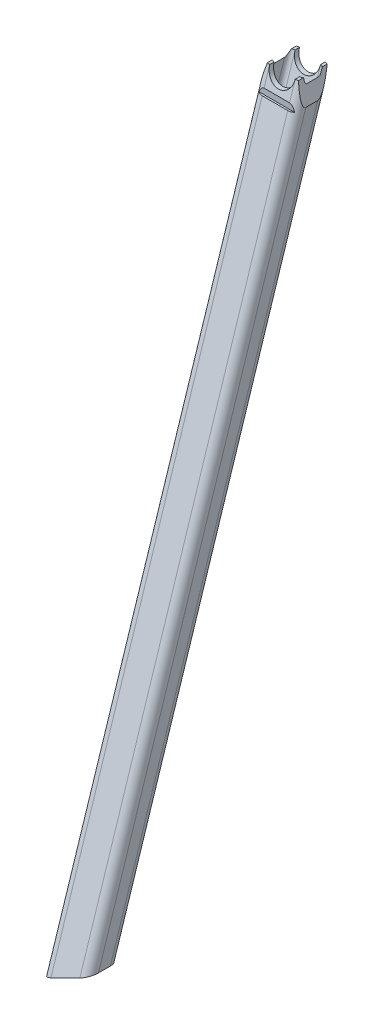
ISO-10303-21;
HEADER;
FILE_DESCRIPTION(('STEP AP214'),'2;1');
FILE_NAME('part.step','',(''),(''),'','','');
FILE_SCHEMA(('AUTOMOTIVE_DESIGN { 1 0 10303 214 1 1 1 1 }'));
ENDSEC;
DATA;
#1=APPLICATION_CONTEXT('core data for automotive mechanical design processes');
#2=APPLICATION_PROTOCOL_DEFINITION('international standard','automotive_design',2000,#1);
#3=PRODUCT_CONTEXT('',#1,'mechanical');
#4=PRODUCT('Part','Part','',(#3));
#5=PRODUCT_RELATED_PRODUCT_CATEGORY('part','',(#4));
#6=PRODUCT_DEFINITION_FORMATION('','',#4);
#7=PRODUCT_DEFINITION_CONTEXT('part definition',#1,'design');
#8=PRODUCT_DEFINITION('design','',#6,#7);
#9=PRODUCT_DEFINITION_SHAPE('','',#8);
#10=(LENGTH_UNIT() NAMED_UNIT(*) SI_UNIT(.MILLI.,.METRE.));
#11=(NAMED_UNIT(*) PLANE_ANGLE_UNIT() SI_UNIT($,.RADIAN.));
#12=(NAMED_UNIT(*) SI_UNIT($,.STERADIAN.) SOLID_ANGLE_UNIT());
#13=UNCERTAINTY_MEASURE_WITH_UNIT(LENGTH_MEASURE(1.E-05),#10,'distance_accuracy_value','');
#14=(GEOMETRIC_REPRESENTATION_CONTEXT(3) GLOBAL_UNCERTAINTY_ASSIGNED_CONTEXT((#13)) GLOBAL_UNIT_ASSIGNED_CONTEXT((#10,
#11,#12)) REPRESENTATION_CONTEXT('',''));
#15=CARTESIAN_POINT('',(0.,0.,0.));
#16=DIRECTION('',(0.,0.,1.));
#17=DIRECTION('',(1.,0.,0.));
#18=AXIS2_PLACEMENT_3D('',#15,#16,#17);
#19=CARTESIAN_POINT('',(0.,3.057033245491,9.52126817897499));
#20=DIRECTION('',(0.,-0.305703324549103,-0.952126817897504));
#21=DIRECTION('',(0.,0.952126817897505,-0.305703324549102));
#22=AXIS2_PLACEMENT_3D('',#19,#20,#21);
#23=PLANE('',#22);
#24=DIRECTION('',(-1.,0.,0.));
#25=VECTOR('',#24,1.);
#26=CARTESIAN_POINT('',(2.22044604925031E-13,-12.4494519813519,14.5));
#27=LINE('',#26,#25);
#28=CARTESIAN_POINT('',(9.00000000000001,-12.4494519813525,14.4999999999999));
#29=VERTEX_POINT('',#28);
#30=CARTESIAN_POINT('',(-9.00000000000001,-12.4494519813525,14.5));
#31=VERTEX_POINT('',#30);
#32=EDGE_CURVE('E206',#29,#31,#27,.T.);
#33=ORIENTED_EDGE('',*,*,#32,.F.);
#34=DIRECTION('',(0.,-0.952126817897505,0.305703324549102));
#35=VECTOR('',#34,1.);
#36=CARTESIAN_POINT('',(9.00000000000134,-1.11022302462516E-13,10.5028025805239));
#37=LINE('',#36,#35);
#38=CARTESIAN_POINT('',(9.00000000000134,-1.11022302462516E-13,10.5028025805239));
#39=VERTEX_POINT('',#38);
#40=EDGE_CURVE('E217',#29,#39,#37,.F.);
#41=ORIENTED_EDGE('',*,*,#40,.T.);
#42=CARTESIAN_POINT('',(0.,0.,10.5028025805239));
#43=DIRECTION('',(0.,-0.305703324549103,-0.952126817897504));
#44=DIRECTION('',(0.,-0.952126817897505,0.305703324549102));
#45=AXIS2_PLACEMENT_3D('',#42,#43,#44);
#46=ELLIPSE('',#45,9.45252232247159,9.);
#47=CARTESIAN_POINT('',(-9.00000000000001,-1.11022302462516E-13,10.5028025805239));
#48=VERTEX_POINT('',#47);
#49=EDGE_CURVE('E286',#39,#48,#46,.T.);
#50=ORIENTED_EDGE('',*,*,#49,.T.);
#51=DIRECTION('',(0.,0.952126817897505,-0.305703324549102));
#52=VECTOR('',#51,1.);
#53=CARTESIAN_POINT('',(-8.9999999999999,-483.960112896616,165.889892493982));
#54=LINE('',#53,#52);
#55=EDGE_CURVE('E339',#48,#31,#54,.F.);
#56=ORIENTED_EDGE('',*,*,#55,.T.);
#57=EDGE_LOOP('',(#33,#41,#50,#56));
#58=FACE_BOUND('',#57,.T.);
#59=ADVANCED_FACE('F44',(#58),#23,.F.);
#60=DIRECTION('',(1.,0.,0.));
#61=VECTOR('',#60,1.);
#62=CARTESIAN_POINT('',(0.,-16.5,15.8005263293399));
#63=LINE('',#62,#61);
#64=CARTESIAN_POINT('',(-9.00000000000001,-16.5000000000001,15.8005263293399));
#65=VERTEX_POINT('',#64);
#66=CARTESIAN_POINT('',(9.00000000000156,-16.5000000000001,15.8005263293399));
#67=VERTEX_POINT('',#66);
#68=EDGE_CURVE('E203',#65,#67,#63,.T.);
#69=ORIENTED_EDGE('',*,*,#68,.F.);
#70=CARTESIAN_POINT('',(-9.00000000000001,-481.413263999358,165.072165106852));
#71=VERTEX_POINT('',#70);
#72=EDGE_CURVE('E336',#65,#71,#54,.F.);
#73=ORIENTED_EDGE('',*,*,#72,.T.);
#74=DIRECTION('',(0.913345512368732,0.387692168498585,-0.124477939896055));
#75=VECTOR('',#74,1.);
#76=CARTESIAN_POINT('',(187.742025958265,-397.901228690018,138.258607969261));
#77=LINE('',#76,#75);
#78=CARTESIAN_POINT('',(9.00000000000001,-473.772717307585,162.618982945461));
#79=VERTEX_POINT('',#78);
#80=EDGE_CURVE('E298',#71,#79,#77,.T.);
#81=ORIENTED_EDGE('',*,*,#80,.T.);
#82=EDGE_CURVE('E345',#79,#67,#37,.F.);
#83=ORIENTED_EDGE('',*,*,#82,.T.);
#84=EDGE_LOOP('',(#69,#73,#81,#83));
#85=FACE_BOUND('',#84,.T.);
#86=ADVANCED_FACE('F385',(#85),#23,.F.);
#87=CARTESIAN_POINT('',(9.00000000000201,20.2653496561468,-2.30555921939207));
#88=DIRECTION('',(0.,0.952126817897505,-0.305703324549102));
#89=DIRECTION('',(0.,0.305703324549103,0.952126817897504));
#90=AXIS2_PLACEMENT_3D('',#87,#88,#89);
#91=CYLINDRICAL_SURFACE('',#90,6.);
#92=ORIENTED_EDGE('',*,*,#40,.F.);
#93=CARTESIAN_POINT('',(9.00000000000001,-32.0763239129865,14.5));
#94=DIRECTION('',(0.,0.,1.));
#95=DIRECTION('',(0.,1.,0.));
#96=AXIS2_PLACEMENT_3D('',#93,#94,#95);
#97=ELLIPSE('',#96,19.6268719316341,6.);
#98=CARTESIAN_POINT('',(12.6504642541504,-16.5,14.5));
#99=VERTEX_POINT('',#98);
#100=EDGE_CURVE('E215',#29,#99,#97,.F.);
#101=ORIENTED_EDGE('',*,*,#100,.T.);
#102=CARTESIAN_POINT('',(9.00000000000156,-16.5000000000001,9.49884478102551));
#103=DIRECTION('',(0.,1.,0.));
#104=DIRECTION('',(0.,0.,-1.));
#105=AXIS2_PLACEMENT_3D('',#102,#103,#104);
#106=ELLIPSE('',#105,6.30168154831439,6.);
#107=EDGE_CURVE('E201',#99,#67,#106,.F.);
#108=ORIENTED_EDGE('',*,*,#107,.T.);
#109=ORIENTED_EDGE('',*,*,#82,.F.);
#110=CARTESIAN_POINT('',(8.9999999999999,-473.772717307585,156.317301397147));
#111=DIRECTION('',(-0.390731128489274,0.920504853452441,0.));
#112=DIRECTION('',(0.711194291827604,0.301884066312843,-0.634876909155039));
#113=AXIS2_PLACEMENT_3D('',#110,#111,#112);
#114=ELLIPSE('',#113,6.84589714511482,6.);
#115=CARTESIAN_POINT('',(15.0000000000001,-471.225868410327,155.499574010017));
#116=VERTEX_POINT('',#115);
#117=EDGE_CURVE('E330',#116,#79,#114,.F.);
#118=ORIENTED_EDGE('',*,*,#117,.F.);
#119=DIRECTION('',(0.,-0.952126817897505,0.305703324549102));
#120=VECTOR('',#119,1.);
#121=CARTESIAN_POINT('',(15.,-473.060088357622,156.088494650946));
#122=LINE('',#121,#120);
#123=CARTESIAN_POINT('',(15.,-14.9999999999999,9.01723353113309));
#124=VERTEX_POINT('',#123);
#125=EDGE_CURVE('E331',#124,#116,#122,.T.);
#126=ORIENTED_EDGE('',*,*,#125,.F.);
#127=CARTESIAN_POINT('',(9.00000000000201,7.3923048454132,1.8276429147532));
#128=DIRECTION('',(-0.965925826289067,-0.25881904510253,0.));
#129=DIRECTION('',(-0.245605956195241,0.916613907162153,-0.315430910784522));
#130=AXIS2_PLACEMENT_3D('',#127,#128,#129);
#131=ELLIPSE('',#130,24.347827826264,6.);
#132=CARTESIAN_POINT('',(10.980762113533,0.,10.1495083750219));
#133=VERTEX_POINT('',#132);
#134=EDGE_CURVE('E361',#124,#133,#131,.T.);
#135=ORIENTED_EDGE('',*,*,#134,.T.);
#136=CARTESIAN_POINT('',(9.00000000000134,1.11022302462516E-13,4.20112103220954));
#137=DIRECTION('',(0.,1.,0.));
#138=DIRECTION('',(0.,0.,-1.));
#139=AXIS2_PLACEMENT_3D('',#136,#137,#138);
#140=ELLIPSE('',#139,6.30168154831439,6.);
#141=EDGE_CURVE('E314',#39,#133,#140,.T.);
#142=ORIENTED_EDGE('',*,*,#141,.F.);
#143=EDGE_LOOP('',(#92,#101,#108,#109,#118,#126,#135,#142));
#144=FACE_BOUND('',#143,.T.);
#145=ADVANCED_FACE('F220',(#144),#91,.T.);
#146=CARTESIAN_POINT('',(-8.99999999999956,20.2653496561463,-2.3055592193921));
#147=DIRECTION('',(0.,-0.952126817897505,0.305703324549102));
#148=DIRECTION('',(0.,-0.305703324549103,-0.952126817897504));
#149=AXIS2_PLACEMENT_3D('',#146,#147,#148);
#150=CYLINDRICAL_SURFACE('',#149,6.);
#151=CARTESIAN_POINT('',(-9.00000000000001,-16.5000000000001,9.49884478102551));
#152=DIRECTION('',(0.,1.,0.));
#153=DIRECTION('',(0.,0.,1.));
#154=AXIS2_PLACEMENT_3D('',#151,#152,#153);
#155=ELLIPSE('',#154,6.30168154831439,6.);
#156=CARTESIAN_POINT('',(-12.6504642541503,-16.5000000000001,14.5));
#157=VERTEX_POINT('',#156);
#158=EDGE_CURVE('E53',#65,#157,#155,.F.);
#159=ORIENTED_EDGE('',*,*,#158,.T.);
#160=CARTESIAN_POINT('',(-8.9999999999999,-32.0763239129867,14.5));
#161=DIRECTION('',(0.,0.,1.));
#162=DIRECTION('',(0.,-1.,0.));
#163=AXIS2_PLACEMENT_3D('',#160,#161,#162);
#164=ELLIPSE('',#163,19.6268719316341,6.);
#165=EDGE_CURVE('E12',#157,#31,#164,.F.);
#166=ORIENTED_EDGE('',*,*,#165,.T.);
#167=ORIENTED_EDGE('',*,*,#55,.F.);
#168=CARTESIAN_POINT('',(-9.00000000000001,-1.11022302462516E-13,4.20112103220954));
#169=DIRECTION('',(0.,1.,0.));
#170=DIRECTION('',(0.,0.,1.));
#171=AXIS2_PLACEMENT_3D('',#168,#169,#170);
#172=ELLIPSE('',#171,6.30168154831439,6.);
#173=CARTESIAN_POINT('',(-10.9807621135328,-1.11022302462516E-13,10.1495083750219));
#174=VERTEX_POINT('',#173);
#175=EDGE_CURVE('E308',#174,#48,#172,.T.);
#176=ORIENTED_EDGE('',*,*,#175,.F.);
#177=CARTESIAN_POINT('',(-9.00000000000012,7.39230484541464,1.8276429147532));
#178=DIRECTION('',(0.965925826289066,-0.258819045102527,0.));
#179=DIRECTION('',(-0.245605956195242,-0.916613907162153,0.315430910784522));
#180=AXIS2_PLACEMENT_3D('',#177,#178,#179);
#181=ELLIPSE('',#180,24.347827826264,6.);
#182=CARTESIAN_POINT('',(-15.,-15.,9.01723353113316));
#183=VERTEX_POINT('',#182);
#184=EDGE_CURVE('E356',#174,#183,#181,.T.);
#185=ORIENTED_EDGE('',*,*,#184,.T.);
#186=DIRECTION('',(0.,0.952126817897505,-0.305703324549102));
#187=VECTOR('',#186,1.);
#188=CARTESIAN_POINT('',(-14.9999999999979,-1.83421994729449,4.79004167313892));
#189=LINE('',#188,#187);
#190=CARTESIAN_POINT('',(-15.0000000000005,-483.960112896616,159.588210945667));
#191=VERTEX_POINT('',#190);
#192=EDGE_CURVE('E317',#191,#183,#189,.T.);
#193=ORIENTED_EDGE('',*,*,#192,.F.);
#194=CARTESIAN_POINT('',(-9.00000000000001,-481.413263999358,158.770483558537));
#195=DIRECTION('',(-0.390731128489274,0.920504853452441,0.));
#196=DIRECTION('',(-0.711194291827604,-0.301884066312843,0.634876909155039));
#197=AXIS2_PLACEMENT_3D('',#194,#195,#196);
#198=ELLIPSE('',#197,6.84589714511482,6.);
#199=EDGE_CURVE('E321',#71,#191,#198,.F.);
#200=ORIENTED_EDGE('',*,*,#199,.F.);
#201=ORIENTED_EDGE('',*,*,#72,.F.);
#202=EDGE_LOOP('',(#159,#166,#167,#176,#185,#193,#200,#201));
#203=FACE_BOUND('',#202,.T.);
#204=ADVANCED_FACE('F376',(#203),#150,.T.);
#205=CARTESIAN_POINT('',(0.,0.,0.));
#206=DIRECTION('',(0.,1.,0.));
#207=DIRECTION('',(0.,0.,1.));
#208=AXIS2_PLACEMENT_3D('',#205,#206,#207);
#209=PLANE('',#208);
#210=ORIENTED_EDGE('',*,*,#141,.T.);
#211=DIRECTION('',(0.,0.,-1.));
#212=VECTOR('',#211,1.);
#213=CARTESIAN_POINT('',(10.980762113533,0.,0.));
#214=LINE('',#213,#212);
#215=CARTESIAN_POINT('',(10.980762113533,0.,6.56753587915757));
#216=VERTEX_POINT('',#215);
#217=EDGE_CURVE('E370',#133,#216,#214,.T.);
#218=ORIENTED_EDGE('',*,*,#217,.T.);
#219=CARTESIAN_POINT('',(9.00000000000134,1.11022302462516E-13,4.20112103220954));
#220=DIRECTION('',(0.,1.,0.));
#221=DIRECTION('',(0.,0.,-1.));
#222=AXIS2_PLACEMENT_3D('',#219,#220,#221);
#223=ELLIPSE('',#222,3.1508407741572,3.);
#224=CARTESIAN_POINT('',(9.00000000000134,1.11022302462516E-13,7.35196180636673));
#225=VERTEX_POINT('',#224);
#226=EDGE_CURVE('E252',#225,#216,#223,.T.);
#227=ORIENTED_EDGE('',*,*,#226,.F.);
#228=DIRECTION('',(0.,0.,1.));
#229=VECTOR('',#228,1.);
#230=CARTESIAN_POINT('',(9.00000000000134,1.11022302462516E-13,-10.5028025805241));
#231=LINE('',#230,#229);
#232=EDGE_CURVE('E285',#39,#225,#231,.F.);
#233=ORIENTED_EDGE('',*,*,#232,.F.);
#234=EDGE_LOOP('',(#210,#218,#227,#233));
#235=FACE_BOUND('',#234,.T.);
#236=ADVANCED_FACE('F408',(#235),#209,.T.);
#237=CARTESIAN_POINT('',(-9.00000000000001,-1.11022302462516E-13,-4.20112103220966));
#238=DIRECTION('',(0.,1.,0.));
#239=DIRECTION('',(0.,0.,-1.));
#240=AXIS2_PLACEMENT_3D('',#237,#238,#239);
#241=ELLIPSE('',#240,6.30168154831439,6.);
#242=CARTESIAN_POINT('',(-9.00000000000001,1.11022302462516E-13,-10.5028025805241));
#243=VERTEX_POINT('',#242);
#244=CARTESIAN_POINT('',(-10.9807621135328,-1.11022302462516E-13,-10.149508375022));
#245=VERTEX_POINT('',#244);
#246=EDGE_CURVE('E316',#243,#245,#241,.T.);
#247=ORIENTED_EDGE('',*,*,#246,.T.);
#248=DIRECTION('',(0.,0.,1.));
#249=VECTOR('',#248,1.);
#250=CARTESIAN_POINT('',(-10.9807621135328,-1.11022302462516E-13,0.));
#251=LINE('',#250,#249);
#252=CARTESIAN_POINT('',(-10.9807621135328,-1.11022302462516E-13,-6.56753587915769));
#253=VERTEX_POINT('',#252);
#254=EDGE_CURVE('E351',#245,#253,#251,.T.);
#255=ORIENTED_EDGE('',*,*,#254,.T.);
#256=CARTESIAN_POINT('',(-9.00000000000001,-1.11022302462516E-13,-4.20112103220966));
#257=DIRECTION('',(0.,1.,0.));
#258=DIRECTION('',(0.,0.,-1.));
#259=AXIS2_PLACEMENT_3D('',#256,#257,#258);
#260=ELLIPSE('',#259,3.1508407741572,3.);
#261=CARTESIAN_POINT('',(-9.00000000000001,1.11022302462516E-13,-7.35196180636685));
#262=VERTEX_POINT('',#261);
#263=EDGE_CURVE('E231',#262,#253,#260,.T.);
#264=ORIENTED_EDGE('',*,*,#263,.F.);
#265=DIRECTION('',(0.,0.,1.));
#266=VECTOR('',#265,1.);
#267=CARTESIAN_POINT('',(-9.00000000000001,-1.11022302462516E-13,-10.5028025805241));
#268=LINE('',#267,#266);
#269=EDGE_CURVE('E287',#243,#262,#268,.T.);
#270=ORIENTED_EDGE('',*,*,#269,.F.);
#271=EDGE_LOOP('',(#247,#255,#264,#270));
#272=FACE_BOUND('',#271,.T.);
#273=ADVANCED_FACE('F447',(#272),#209,.T.);
#274=CARTESIAN_POINT('',(0.,0.,-10.5028025805241));
#275=DIRECTION('',(0.,0.,1.));
#276=DIRECTION('',(1.,0.,0.));
#277=AXIS2_PLACEMENT_3D('',#274,#275,#276);
#278=CYLINDRICAL_SURFACE('',#277,9.);
#279=CARTESIAN_POINT('',(0.,0.,-7.35196180636687));
#280=DIRECTION('',(0.,-0.305703324549103,-0.952126817897504));
#281=DIRECTION('',(0.,-0.952126817897505,0.305703324549102));
#282=AXIS2_PLACEMENT_3D('',#279,#280,#281);
#283=ELLIPSE('',#282,9.45252232247159,9.);
#284=CARTESIAN_POINT('',(9.00000000000134,1.11022302462516E-13,-7.35196180636687));
#285=VERTEX_POINT('',#284);
#286=EDGE_CURVE('E222',#285,#262,#283,.T.);
#287=ORIENTED_EDGE('',*,*,#286,.F.);
#288=CARTESIAN_POINT('',(9.00000000000134,1.11022302462516E-13,-10.5028025805241));
#289=VERTEX_POINT('',#288);
#290=EDGE_CURVE('E282',#285,#289,#231,.F.);
#291=ORIENTED_EDGE('',*,*,#290,.T.);
#292=CARTESIAN_POINT('',(0.,0.,-10.5028025805241));
#293=DIRECTION('',(0.,-0.305703324549103,-0.952126817897504));
#294=DIRECTION('',(0.,-0.952126817897505,0.305703324549102));
#295=AXIS2_PLACEMENT_3D('',#292,#293,#294);
#296=ELLIPSE('',#295,9.45252232247159,9.);
#297=EDGE_CURVE('E246',#289,#243,#296,.T.);
#298=ORIENTED_EDGE('',*,*,#297,.T.);
#299=ORIENTED_EDGE('',*,*,#269,.T.);
#300=EDGE_LOOP('',(#287,#291,#298,#299));
#301=FACE_BOUND('',#300,.T.);
#302=ADVANCED_FACE('F441',(#301),#278,.F.);
#303=CARTESIAN_POINT('',(-9.00000000000001,-1.11022302462516E-13,4.20112103220954));
#304=DIRECTION('',(0.,1.,0.));
#305=DIRECTION('',(0.,0.,1.));
#306=AXIS2_PLACEMENT_3D('',#303,#304,#305);
#307=ELLIPSE('',#306,3.1508407741572,3.);
#308=CARTESIAN_POINT('',(-10.9807621135328,-1.11022302462516E-13,6.56753587915757));
#309=VERTEX_POINT('',#308);
#310=CARTESIAN_POINT('',(-9.00000000000001,-1.11022302462516E-13,7.35196180636673));
#311=VERTEX_POINT('',#310);
#312=EDGE_CURVE('E239',#309,#311,#307,.T.);
#313=ORIENTED_EDGE('',*,*,#312,.F.);
#314=DIRECTION('',(0.,0.,1.));
#315=VECTOR('',#314,1.);
#316=CARTESIAN_POINT('',(-10.9807621135328,-1.11022302462516E-13,0.));
#317=LINE('',#316,#315);
#318=EDGE_CURVE('E347',#309,#174,#317,.T.);
#319=ORIENTED_EDGE('',*,*,#318,.T.);
#320=ORIENTED_EDGE('',*,*,#175,.T.);
#321=EDGE_CURVE('E283',#311,#48,#268,.T.);
#322=ORIENTED_EDGE('',*,*,#321,.F.);
#323=EDGE_LOOP('',(#313,#319,#320,#322));
#324=FACE_BOUND('',#323,.T.);
#325=ADVANCED_FACE('F534',(#324),#209,.T.);
#326=CARTESIAN_POINT('',(9.00000000000134,1.11022302462516E-13,-4.20112103220966));
#327=DIRECTION('',(0.,1.,0.));
#328=DIRECTION('',(0.,0.,1.));
#329=AXIS2_PLACEMENT_3D('',#326,#327,#328);
#330=ELLIPSE('',#329,3.1508407741572,3.);
#331=CARTESIAN_POINT('',(10.980762113533,0.,-6.56753587915769));
#332=VERTEX_POINT('',#331);
#333=EDGE_CURVE('E259',#332,#285,#330,.T.);
#334=ORIENTED_EDGE('',*,*,#333,.F.);
#335=DIRECTION('',(0.,0.,-1.));
#336=VECTOR('',#335,1.);
#337=CARTESIAN_POINT('',(10.980762113533,0.,0.));
#338=LINE('',#337,#336);
#339=CARTESIAN_POINT('',(10.980762113533,0.,-10.149508375022));
#340=VERTEX_POINT('',#339);
#341=EDGE_CURVE('E369',#332,#340,#338,.T.);
#342=ORIENTED_EDGE('',*,*,#341,.T.);
#343=CARTESIAN_POINT('',(9.00000000000134,1.11022302462516E-13,-4.20112103220966));
#344=DIRECTION('',(0.,1.,0.));
#345=DIRECTION('',(0.,0.,1.));
#346=AXIS2_PLACEMENT_3D('',#343,#344,#345);
#347=ELLIPSE('',#346,6.30168154831439,6.);
#348=EDGE_CURVE('E313',#340,#289,#347,.T.);
#349=ORIENTED_EDGE('',*,*,#348,.T.);
#350=ORIENTED_EDGE('',*,*,#290,.F.);
#351=EDGE_LOOP('',(#334,#342,#349,#350));
#352=FACE_BOUND('',#351,.T.);
#353=ADVANCED_FACE('F472',(#352),#209,.T.);
#354=CARTESIAN_POINT('',(-14.9999999999999,22.0995696034412,3.40720168799301));
#355=DIRECTION('',(-1.,0.,0.));
#356=DIRECTION('',(0.,0.,1.));
#357=AXIS2_PLACEMENT_3D('',#354,#355,#356);
#358=PLANE('',#357);
#359=ORIENTED_EDGE('',*,*,#192,.T.);
#360=DIRECTION('',(0.,0.,-1.));
#361=VECTOR('',#360,1.);
#362=CARTESIAN_POINT('',(-15.,-15.,3.40720168799301));
#363=LINE('',#362,#361);
#364=CARTESIAN_POINT('',(-15.,-15.,0.614991466713946));
#365=VERTEX_POINT('',#364);
#366=EDGE_CURVE('E342',#183,#365,#363,.T.);
#367=ORIENTED_EDGE('',*,*,#366,.T.);
#368=DIRECTION('',(0.,0.952126817897505,-0.305703324549102));
#369=VECTOR('',#368,1.);
#370=CARTESIAN_POINT('',(-15.,17.8197230597538,-9.92257376257209));
#371=LINE('',#370,#369);
#372=CARTESIAN_POINT('',(-15.0000000000005,-483.960112896616,151.185968881248));
#373=VERTEX_POINT('',#372);
#374=EDGE_CURVE('E323',#365,#373,#371,.F.);
#375=ORIENTED_EDGE('',*,*,#374,.T.);
#376=DIRECTION('',(0.,0.,-1.));
#377=VECTOR('',#376,1.);
#378=CARTESIAN_POINT('',(-15.,-483.960112896616,3.40720168799301));
#379=LINE('',#378,#377);
#380=EDGE_CURVE('E292',#191,#373,#379,.T.);
#381=ORIENTED_EDGE('',*,*,#380,.F.);
#382=EDGE_LOOP('',(#359,#367,#375,#381));
#383=FACE_BOUND('',#382,.T.);
#384=ADVANCED_FACE('F430',(#383),#358,.T.);
#385=CARTESIAN_POINT('',(15.0000000000005,22.0995696034423,3.40720168799301));
#386=DIRECTION('',(1.,0.,0.));
#387=DIRECTION('',(0.,0.,-1.));
#388=AXIS2_PLACEMENT_3D('',#385,#386,#387);
#389=PLANE('',#388);
#390=DIRECTION('',(0.,-0.952126817897505,0.305703324549102));
#391=VECTOR('',#390,1.);
#392=CARTESIAN_POINT('',(15.,17.8197230597538,-9.9225737625721));
#393=LINE('',#392,#391);
#394=CARTESIAN_POINT('',(15.0000000000001,-471.225868410327,147.097331945598));
#395=VERTEX_POINT('',#394);
#396=CARTESIAN_POINT('',(15.,-15.,0.614991466713994));
#397=VERTEX_POINT('',#396);
#398=EDGE_CURVE('E334',#395,#397,#393,.F.);
#399=ORIENTED_EDGE('',*,*,#398,.T.);
#400=DIRECTION('',(0.,0.,1.));
#401=VECTOR('',#400,1.);
#402=CARTESIAN_POINT('',(15.,-15.,3.40720168799301));
#403=LINE('',#402,#401);
#404=EDGE_CURVE('E362',#397,#124,#403,.T.);
#405=ORIENTED_EDGE('',*,*,#404,.T.);
#406=ORIENTED_EDGE('',*,*,#125,.T.);
#407=DIRECTION('',(0.,0.,1.));
#408=VECTOR('',#407,1.);
#409=CARTESIAN_POINT('',(14.9999999999999,-471.225868410327,3.40720168799301));
#410=LINE('',#409,#408);
#411=EDGE_CURVE('E291',#395,#116,#410,.T.);
#412=ORIENTED_EDGE('',*,*,#411,.F.);
#413=EDGE_LOOP('',(#399,#405,#406,#412));
#414=FACE_BOUND('',#413,.T.);
#415=ADVANCED_FACE('F391',(#414),#389,.T.);
#416=CARTESIAN_POINT('',(0.,-3.057033245491,-9.52126817897509));
#417=DIRECTION('',(0.,-0.305703324549103,-0.952126817897504));
#418=DIRECTION('',(0.,0.952126817897505,-0.305703324549102));
#419=AXIS2_PLACEMENT_3D('',#416,#417,#418);
#420=PLANE('',#419);
#421=ORIENTED_EDGE('',*,*,#297,.F.);
#422=DIRECTION('',(0.,-0.952126817897505,0.305703324549102));
#423=VECTOR('',#422,1.);
#424=CARTESIAN_POINT('',(9.00000000000023,-3.05703324549189,-9.5212681789751));
#425=LINE('',#424,#423);
#426=CARTESIAN_POINT('',(8.9999999999999,-473.772717307585,141.613377784413));
#427=VERTEX_POINT('',#426);
#428=EDGE_CURVE('E302',#289,#427,#425,.T.);
#429=ORIENTED_EDGE('',*,*,#428,.T.);
#430=DIRECTION('',(0.913345512368732,0.387692168498585,-0.124477939896055));
#431=VECTOR('',#430,1.);
#432=CARTESIAN_POINT('',(185.353869976186,-398.914940761591,117.57847956676));
#433=LINE('',#432,#431);
#434=CARTESIAN_POINT('',(-9.00000000000001,-481.413263999358,144.066559945804));
#435=VERTEX_POINT('',#434);
#436=EDGE_CURVE('E303',#435,#427,#433,.T.);
#437=ORIENTED_EDGE('',*,*,#436,.F.);
#438=DIRECTION('',(0.,0.952126817897505,-0.305703324549102));
#439=VECTOR('',#438,1.);
#440=CARTESIAN_POINT('',(-8.99999999999801,-3.057033245491,-9.52126817897509));
#441=LINE('',#440,#439);
#442=EDGE_CURVE('E310',#435,#243,#441,.T.);
#443=ORIENTED_EDGE('',*,*,#442,.T.);
#444=EDGE_LOOP('',(#421,#429,#437,#443));
#445=FACE_BOUND('',#444,.T.);
#446=ADVANCED_FACE('F439',(#445),#420,.T.);
#447=CARTESIAN_POINT('',(171.775823269904,-404.678479641725,0.));
#448=DIRECTION('',(-0.390731128489274,0.920504853452441,0.));
#449=DIRECTION('',(-0.920504853452442,-0.390731128489275,0.));
#450=AXIS2_PLACEMENT_3D('',#447,#448,#449);
#451=PLANE('',#450);
#452=DIRECTION('',(0.,0.,-1.));
#453=VECTOR('',#452,1.);
#454=CARTESIAN_POINT('',(-12.,-482.686688447987,3.407201687993));
#455=LINE('',#454,#453);
#456=CARTESIAN_POINT('',(-12.,-482.686688447987,159.179347252102));
#457=VERTEX_POINT('',#456);
#458=CARTESIAN_POINT('',(-12.,-482.686688447987,150.777105187683));
#459=VERTEX_POINT('',#458);
#460=EDGE_CURVE('E264',#457,#459,#455,.T.);
#461=ORIENTED_EDGE('',*,*,#460,.F.);
#462=CARTESIAN_POINT('',(-9.00000000000001,-481.413263999358,158.770483558537));
#463=DIRECTION('',(-0.390731128489274,0.920504853452441,0.));
#464=DIRECTION('',(-0.711194291827604,-0.301884066312843,0.634876909155039));
#465=AXIS2_PLACEMENT_3D('',#462,#463,#464);
#466=ELLIPSE('',#465,3.42294857255741,3.);
#467=CARTESIAN_POINT('',(-9.00000000000001,-481.413263999358,161.921324332695));
#468=VERTEX_POINT('',#467);
#469=EDGE_CURVE('E227',#468,#457,#466,.F.);
#470=ORIENTED_EDGE('',*,*,#469,.F.);
#471=DIRECTION('',(0.913345512368732,0.387692168498585,-0.124477939896055));
#472=VECTOR('',#471,1.);
#473=CARTESIAN_POINT('',(187.383802560954,-398.053285500754,135.156588708886));
#474=LINE('',#473,#472);
#475=CARTESIAN_POINT('',(8.9999999999999,-473.772717307585,159.468142171304));
#476=VERTEX_POINT('',#475);
#477=EDGE_CURVE('E270',#468,#476,#474,.T.);
#478=ORIENTED_EDGE('',*,*,#477,.T.);
#479=CARTESIAN_POINT('',(8.9999999999999,-473.772717307585,156.317301397147));
#480=DIRECTION('',(-0.390731128489274,0.920504853452441,0.));
#481=DIRECTION('',(0.711194291827604,0.301884066312843,-0.634876909155039));
#482=AXIS2_PLACEMENT_3D('',#479,#480,#481);
#483=ELLIPSE('',#482,3.42294857255741,3.);
#484=CARTESIAN_POINT('',(12.,-472.499292858956,155.908437703582));
#485=VERTEX_POINT('',#484);
#486=EDGE_CURVE('E273',#485,#476,#483,.F.);
#487=ORIENTED_EDGE('',*,*,#486,.F.);
#488=DIRECTION('',(0.,0.,1.));
#489=VECTOR('',#488,1.);
#490=CARTESIAN_POINT('',(12.,-472.499292858957,3.40720168799301));
#491=LINE('',#490,#489);
#492=CARTESIAN_POINT('',(12.0000000000019,-472.499292858955,147.506195639163));
#493=VERTEX_POINT('',#492);
#494=EDGE_CURVE('E257',#493,#485,#491,.T.);
#495=ORIENTED_EDGE('',*,*,#494,.F.);
#496=CARTESIAN_POINT('',(8.9999999999999,-473.772717307585,147.915059332728));
#497=DIRECTION('',(-0.390731128489274,0.920504853452441,0.));
#498=DIRECTION('',(-0.711194291827604,-0.301884066312843,0.634876909155039));
#499=AXIS2_PLACEMENT_3D('',#496,#497,#498);
#500=ELLIPSE('',#499,3.42294857255741,3.);
#501=CARTESIAN_POINT('',(9.00000000000001,-473.772717307585,144.764218558571));
#502=VERTEX_POINT('',#501);
#503=EDGE_CURVE('E267',#502,#493,#500,.F.);
#504=ORIENTED_EDGE('',*,*,#503,.F.);
#505=DIRECTION('',(0.913345512368732,0.387692168498585,-0.124477939896055));
#506=VECTOR('',#505,1.);
#507=CARTESIAN_POINT('',(185.712093373498,-398.762883950855,120.680498827136));
#508=LINE('',#507,#506);
#509=CARTESIAN_POINT('',(-9.00000000000001,-481.413263999358,147.217400719961));
#510=VERTEX_POINT('',#509);
#511=EDGE_CURVE('E238',#510,#502,#508,.T.);
#512=ORIENTED_EDGE('',*,*,#511,.F.);
#513=CARTESIAN_POINT('',(-9.00000000000001,-481.413263999358,150.368241494118));
#514=DIRECTION('',(-0.390731128489274,0.920504853452441,0.));
#515=DIRECTION('',(0.711194291827604,0.301884066312843,-0.634876909155039));
#516=AXIS2_PLACEMENT_3D('',#513,#514,#515);
#517=ELLIPSE('',#516,3.42294857255741,3.);
#518=EDGE_CURVE('E247',#459,#510,#517,.F.);
#519=ORIENTED_EDGE('',*,*,#518,.F.);
#520=EDGE_LOOP('',(#461,#470,#478,#487,#495,#504,#512,#519));
#521=FACE_BOUND('',#520,.T.);
#522=ORIENTED_EDGE('',*,*,#380,.T.);
#523=CARTESIAN_POINT('',(-9.00000000000001,-481.413263999358,150.368241494118));
#524=DIRECTION('',(-0.390731128489274,0.920504853452441,0.));
#525=DIRECTION('',(0.711194291827604,0.301884066312843,-0.634876909155039));
#526=AXIS2_PLACEMENT_3D('',#523,#524,#525);
#527=ELLIPSE('',#526,6.84589714511482,6.);
#528=EDGE_CURVE('E333',#373,#435,#527,.F.);
#529=ORIENTED_EDGE('',*,*,#528,.T.);
#530=ORIENTED_EDGE('',*,*,#436,.T.);
#531=CARTESIAN_POINT('',(8.9999999999999,-473.772717307585,147.915059332728));
#532=DIRECTION('',(-0.390731128489274,0.920504853452441,0.));
#533=DIRECTION('',(-0.711194291827604,-0.301884066312843,0.634876909155039));
#534=AXIS2_PLACEMENT_3D('',#531,#532,#533);
#535=ELLIPSE('',#534,6.84589714511482,6.);
#536=EDGE_CURVE('E327',#427,#395,#535,.F.);
#537=ORIENTED_EDGE('',*,*,#536,.T.);
#538=ORIENTED_EDGE('',*,*,#411,.T.);
#539=ORIENTED_EDGE('',*,*,#117,.T.);
#540=ORIENTED_EDGE('',*,*,#80,.F.);
#541=ORIENTED_EDGE('',*,*,#199,.T.);
#542=EDGE_LOOP('',(#522,#529,#530,#537,#538,#539,#540,#541));
#543=FACE_BOUND('',#542,.T.);
#544=ADVANCED_FACE('F386',(#521,#543),#451,.F.);
#545=CARTESIAN_POINT('',(-9.00000000000001,-1.2228132981964,-3.80850727159007));
#546=DIRECTION('',(0.,0.952126817897505,-0.305703324549102));
#547=DIRECTION('',(0.,0.305703324549103,0.952126817897504));
#548=AXIS2_PLACEMENT_3D('',#545,#546,#547);
#549=CYLINDRICAL_SURFACE('',#548,6.);
#550=ORIENTED_EDGE('',*,*,#374,.F.);
#551=CARTESIAN_POINT('',(-9.00000000000012,7.39230484541464,-6.574599149666));
#552=DIRECTION('',(0.965925826289066,-0.258819045102527,0.));
#553=DIRECTION('',(0.245605956195242,0.916613907162153,-0.315430910784522));
#554=AXIS2_PLACEMENT_3D('',#551,#552,#553);
#555=ELLIPSE('',#554,24.347827826264,6.);
#556=EDGE_CURVE('E350',#365,#245,#555,.T.);
#557=ORIENTED_EDGE('',*,*,#556,.T.);
#558=ORIENTED_EDGE('',*,*,#246,.F.);
#559=ORIENTED_EDGE('',*,*,#442,.F.);
#560=ORIENTED_EDGE('',*,*,#528,.F.);
#561=EDGE_LOOP('',(#550,#557,#558,#559,#560));
#562=FACE_BOUND('',#561,.T.);
#563=ADVANCED_FACE('F432',(#562),#549,.T.);
#564=CARTESIAN_POINT('',(9.00000000000001,-1.2228132981964,-3.80850727159007));
#565=DIRECTION('',(0.,-0.952126817897505,0.305703324549102));
#566=DIRECTION('',(0.,-0.305703324549103,-0.952126817897504));
#567=AXIS2_PLACEMENT_3D('',#564,#565,#566);
#568=CYLINDRICAL_SURFACE('',#567,6.);
#569=ORIENTED_EDGE('',*,*,#348,.F.);
#570=CARTESIAN_POINT('',(9.00000000000201,7.3923048454132,-6.574599149666));
#571=DIRECTION('',(-0.965925826289067,-0.25881904510253,0.));
#572=DIRECTION('',(0.245605956195241,-0.916613907162153,0.315430910784522));
#573=AXIS2_PLACEMENT_3D('',#570,#571,#572);
#574=ELLIPSE('',#573,24.347827826264,6.);
#575=EDGE_CURVE('E371',#340,#397,#574,.T.);
#576=ORIENTED_EDGE('',*,*,#575,.T.);
#577=ORIENTED_EDGE('',*,*,#398,.F.);
#578=ORIENTED_EDGE('',*,*,#536,.F.);
#579=ORIENTED_EDGE('',*,*,#428,.F.);
#580=EDGE_LOOP('',(#569,#576,#577,#578,#579));
#581=FACE_BOUND('',#580,.T.);
#582=ADVANCED_FACE('F397',(#581),#568,.T.);
#583=ORIENTED_EDGE('',*,*,#232,.T.);
#584=CARTESIAN_POINT('',(0.,0.,7.35196180636674));
#585=DIRECTION('',(0.,-0.305703324549103,-0.952126817897504));
#586=DIRECTION('',(0.,-0.952126817897505,0.305703324549102));
#587=AXIS2_PLACEMENT_3D('',#584,#585,#586);
#588=ELLIPSE('',#587,9.45252232247159,9.);
#589=EDGE_CURVE('E223',#225,#311,#588,.T.);
#590=ORIENTED_EDGE('',*,*,#589,.T.);
#591=ORIENTED_EDGE('',*,*,#321,.T.);
#592=ORIENTED_EDGE('',*,*,#49,.F.);
#593=EDGE_LOOP('',(#583,#590,#591,#592));
#594=FACE_BOUND('',#593,.T.);
#595=ADVANCED_FACE('F409',(#594),#278,.F.);
#596=CARTESIAN_POINT('',(-12.0000000000001,22.0995696034418,3.40720168799301));
#597=DIRECTION('',(-1.,0.,0.));
#598=DIRECTION('',(0.,0.,1.));
#599=AXIS2_PLACEMENT_3D('',#596,#597,#598);
#600=PLANE('',#599);
#601=DIRECTION('',(0.,0.952126817897505,-0.305703324549102));
#602=VECTOR('',#601,1.);
#603=CARTESIAN_POINT('',(-11.9999999999998,-1.22281329819651,-3.80850727159006));
#604=LINE('',#603,#602);
#605=CARTESIAN_POINT('',(-12.,-3.80384757729368,-2.979803841476));
#606=VERTEX_POINT('',#605);
#607=EDGE_CURVE('E230',#606,#459,#604,.F.);
#608=ORIENTED_EDGE('',*,*,#607,.F.);
#609=DIRECTION('',(0.,0.,-1.));
#610=VECTOR('',#609,1.);
#611=CARTESIAN_POINT('',(-12.,-3.80384757729368,3.40720168799301));
#612=LINE('',#611,#610);
#613=CARTESIAN_POINT('',(-12.,-3.80384757729368,5.42243822294319));
#614=VERTEX_POINT('',#613);
#615=EDGE_CURVE('E354',#606,#614,#612,.F.);
#616=ORIENTED_EDGE('',*,*,#615,.T.);
#617=DIRECTION('',(0.,-0.952126817897505,0.305703324549102));
#618=VECTOR('',#617,1.);
#619=CARTESIAN_POINT('',(-11.9999999999979,20.2653496561466,-2.30555921939206));
#620=LINE('',#619,#618);
#621=EDGE_CURVE('E229',#457,#614,#620,.F.);
#622=ORIENTED_EDGE('',*,*,#621,.F.);
#623=ORIENTED_EDGE('',*,*,#460,.T.);
#624=EDGE_LOOP('',(#608,#616,#622,#623));
#625=FACE_BOUND('',#624,.T.);
#626=ADVANCED_FACE('F452',(#625),#600,.F.);
#627=CARTESIAN_POINT('',(12.0000000000002,22.0995696034415,3.407201687993));
#628=DIRECTION('',(1.,0.,0.));
#629=DIRECTION('',(0.,0.,-1.));
#630=AXIS2_PLACEMENT_3D('',#627,#628,#629);
#631=PLANE('',#630);
#632=DIRECTION('',(0.,0.952126817897505,-0.305703324549102));
#633=VECTOR('',#632,1.);
#634=CARTESIAN_POINT('',(12.,20.2653496561465,-2.30555921939211));
#635=LINE('',#634,#633);
#636=CARTESIAN_POINT('',(12.0000000000006,-3.80384757729324,5.42243822294317));
#637=VERTEX_POINT('',#636);
#638=EDGE_CURVE('E243',#637,#485,#635,.F.);
#639=ORIENTED_EDGE('',*,*,#638,.F.);
#640=DIRECTION('',(0.,0.,1.));
#641=VECTOR('',#640,1.);
#642=CARTESIAN_POINT('',(12.0000000000006,-3.80384757729324,3.40720168799301));
#643=LINE('',#642,#641);
#644=CARTESIAN_POINT('',(12.0000000000006,-3.80384757729324,-2.97980384147602));
#645=VERTEX_POINT('',#644);
#646=EDGE_CURVE('E68',#637,#645,#643,.F.);
#647=ORIENTED_EDGE('',*,*,#646,.T.);
#648=DIRECTION('',(0.,-0.952126817897505,0.305703324549102));
#649=VECTOR('',#648,1.);
#650=CARTESIAN_POINT('',(12.0000000000015,-1.22281329819673,-3.80850727159007));
#651=LINE('',#650,#649);
#652=EDGE_CURVE('E244',#493,#645,#651,.F.);
#653=ORIENTED_EDGE('',*,*,#652,.F.);
#654=ORIENTED_EDGE('',*,*,#494,.T.);
#655=EDGE_LOOP('',(#639,#647,#653,#654));
#656=FACE_BOUND('',#655,.T.);
#657=ADVANCED_FACE('F478',(#656),#631,.F.);
#658=CARTESIAN_POINT('',(0.,2.13992327184365,6.66488772528248));
#659=DIRECTION('',(0.,-0.305703324549103,-0.952126817897504));
#660=DIRECTION('',(0.,0.952126817897505,-0.305703324549102));
#661=AXIS2_PLACEMENT_3D('',#658,#659,#660);
#662=PLANE('',#661);
#663=DIRECTION('',(0.,0.952126817897505,-0.305703324549102));
#664=VECTOR('',#663,1.);
#665=CARTESIAN_POINT('',(9.00000000000001,2.13992327184376,6.66488772528248));
#666=LINE('',#665,#664);
#667=EDGE_CURVE('E250',#476,#225,#666,.T.);
#668=ORIENTED_EDGE('',*,*,#667,.F.);
#669=ORIENTED_EDGE('',*,*,#477,.F.);
#670=DIRECTION('',(0.,0.952126817897505,-0.305703324549102));
#671=VECTOR('',#670,1.);
#672=CARTESIAN_POINT('',(-9.00000000000001,2.13992327184376,6.66488772528247));
#673=LINE('',#672,#671);
#674=EDGE_CURVE('E245',#311,#468,#673,.F.);
#675=ORIENTED_EDGE('',*,*,#674,.F.);
#676=ORIENTED_EDGE('',*,*,#589,.F.);
#677=EDGE_LOOP('',(#668,#669,#675,#676));
#678=FACE_BOUND('',#677,.T.);
#679=ADVANCED_FACE('F479',(#678),#662,.T.);
#680=CARTESIAN_POINT('',(1.11022302462516E-13,-2.13992327184376,-6.66488772528258));
#681=DIRECTION('',(0.,-0.305703324549103,-0.952126817897504));
#682=DIRECTION('',(0.,0.952126817897505,-0.305703324549102));
#683=AXIS2_PLACEMENT_3D('',#680,#681,#682);
#684=PLANE('',#683);
#685=ORIENTED_EDGE('',*,*,#286,.T.);
#686=DIRECTION('',(0.,0.952126817897505,-0.305703324549102));
#687=VECTOR('',#686,1.);
#688=CARTESIAN_POINT('',(-8.99999999999879,-2.13992327184509,-6.66488772528258));
#689=LINE('',#688,#687);
#690=EDGE_CURVE('E234',#510,#262,#689,.T.);
#691=ORIENTED_EDGE('',*,*,#690,.F.);
#692=ORIENTED_EDGE('',*,*,#511,.T.);
#693=DIRECTION('',(0.,0.952126817897505,-0.305703324549102));
#694=VECTOR('',#693,1.);
#695=CARTESIAN_POINT('',(8.99999999999945,-2.13992327184376,-6.66488772528258));
#696=LINE('',#695,#694);
#697=EDGE_CURVE('E240',#285,#502,#696,.F.);
#698=ORIENTED_EDGE('',*,*,#697,.F.);
#699=EDGE_LOOP('',(#685,#691,#692,#698));
#700=FACE_BOUND('',#699,.T.);
#701=ADVANCED_FACE('F466',(#700),#684,.F.);
#702=CARTESIAN_POINT('',(-9.00000000000001,-1.2228132981964,-3.80850727159007));
#703=DIRECTION('',(0.,0.952126817897505,-0.305703324549102));
#704=DIRECTION('',(0.,0.305703324549103,0.952126817897504));
#705=AXIS2_PLACEMENT_3D('',#702,#703,#704);
#706=CYLINDRICAL_SURFACE('',#705,3.);
#707=ORIENTED_EDGE('',*,*,#263,.T.);
#708=CARTESIAN_POINT('',(-9.00000000000012,7.39230484541464,-6.574599149666));
#709=DIRECTION('',(0.965925826289066,-0.258819045102527,0.));
#710=DIRECTION('',(0.245605956195242,0.916613907162153,-0.315430910784522));
#711=AXIS2_PLACEMENT_3D('',#708,#709,#710);
#712=ELLIPSE('',#711,12.173913913132,3.);
#713=EDGE_CURVE('E352',#253,#606,#712,.F.);
#714=ORIENTED_EDGE('',*,*,#713,.T.);
#715=ORIENTED_EDGE('',*,*,#607,.T.);
#716=ORIENTED_EDGE('',*,*,#518,.T.);
#717=ORIENTED_EDGE('',*,*,#690,.T.);
#718=EDGE_LOOP('',(#707,#714,#715,#716,#717));
#719=FACE_BOUND('',#718,.T.);
#720=ADVANCED_FACE('F448',(#719),#706,.F.);
#721=CARTESIAN_POINT('',(9.00000000000001,-1.2228132981964,-3.80850727159007));
#722=DIRECTION('',(0.,-0.952126817897505,0.305703324549102));
#723=DIRECTION('',(0.,-0.305703324549103,-0.952126817897504));
#724=AXIS2_PLACEMENT_3D('',#721,#722,#723);
#725=CYLINDRICAL_SURFACE('',#724,3.);
#726=ORIENTED_EDGE('',*,*,#652,.T.);
#727=CARTESIAN_POINT('',(9.00000000000201,7.3923048454132,-6.574599149666));
#728=DIRECTION('',(-0.965925826289067,-0.25881904510253,0.));
#729=DIRECTION('',(0.245605956195241,-0.916613907162153,0.315430910784522));
#730=AXIS2_PLACEMENT_3D('',#727,#728,#729);
#731=ELLIPSE('',#730,12.173913913132,3.);
#732=EDGE_CURVE('E373',#645,#332,#731,.F.);
#733=ORIENTED_EDGE('',*,*,#732,.T.);
#734=ORIENTED_EDGE('',*,*,#333,.T.);
#735=ORIENTED_EDGE('',*,*,#697,.T.);
#736=ORIENTED_EDGE('',*,*,#503,.T.);
#737=EDGE_LOOP('',(#726,#733,#734,#735,#736));
#738=FACE_BOUND('',#737,.T.);
#739=ADVANCED_FACE('F473',(#738),#725,.F.);
#740=CARTESIAN_POINT('',(9.00000000000201,20.2653496561468,-2.30555921939207));
#741=DIRECTION('',(0.,0.952126817897505,-0.305703324549102));
#742=DIRECTION('',(0.,0.305703324549103,0.952126817897504));
#743=AXIS2_PLACEMENT_3D('',#740,#741,#742);
#744=CYLINDRICAL_SURFACE('',#743,3.);
#745=ORIENTED_EDGE('',*,*,#226,.T.);
#746=CARTESIAN_POINT('',(9.00000000000201,7.3923048454132,1.8276429147532));
#747=DIRECTION('',(-0.965925826289067,-0.25881904510253,0.));
#748=DIRECTION('',(-0.245605956195241,0.916613907162153,-0.315430910784522));
#749=AXIS2_PLACEMENT_3D('',#746,#747,#748);
#750=ELLIPSE('',#749,12.173913913132,3.);
#751=EDGE_CURVE('E367',#216,#637,#750,.F.);
#752=ORIENTED_EDGE('',*,*,#751,.T.);
#753=ORIENTED_EDGE('',*,*,#638,.T.);
#754=ORIENTED_EDGE('',*,*,#486,.T.);
#755=ORIENTED_EDGE('',*,*,#667,.T.);
#756=EDGE_LOOP('',(#745,#752,#753,#754,#755));
#757=FACE_BOUND('',#756,.T.);
#758=ADVANCED_FACE('F471',(#757),#744,.F.);
#759=CARTESIAN_POINT('',(-8.99999999999956,20.2653496561463,-2.3055592193921));
#760=DIRECTION('',(0.,-0.952126817897505,0.305703324549102));
#761=DIRECTION('',(0.,-0.305703324549103,-0.952126817897504));
#762=AXIS2_PLACEMENT_3D('',#759,#760,#761);
#763=CYLINDRICAL_SURFACE('',#762,3.);
#764=ORIENTED_EDGE('',*,*,#621,.T.);
#765=CARTESIAN_POINT('',(-9.00000000000012,7.39230484541464,1.8276429147532));
#766=DIRECTION('',(0.965925826289066,-0.258819045102527,0.));
#767=DIRECTION('',(-0.245605956195242,-0.916613907162153,0.315430910784522));
#768=AXIS2_PLACEMENT_3D('',#765,#766,#767);
#769=ELLIPSE('',#768,12.173913913132,3.);
#770=EDGE_CURVE('E360',#614,#309,#769,.F.);
#771=ORIENTED_EDGE('',*,*,#770,.T.);
#772=ORIENTED_EDGE('',*,*,#312,.T.);
#773=ORIENTED_EDGE('',*,*,#674,.T.);
#774=ORIENTED_EDGE('',*,*,#469,.T.);
#775=EDGE_LOOP('',(#764,#771,#772,#773,#774));
#776=FACE_BOUND('',#775,.T.);
#777=ADVANCED_FACE('F460',(#776),#763,.F.);
#778=CARTESIAN_POINT('',(-15.,-15.,3.40720168799301));
#779=DIRECTION('',(0.965925826289066,-0.258819045102527,0.));
#780=DIRECTION('',(0.,0.,-1.));
#781=AXIS2_PLACEMENT_3D('',#778,#779,#780);
#782=PLANE('',#781);
#783=ORIENTED_EDGE('',*,*,#713,.F.);
#784=ORIENTED_EDGE('',*,*,#254,.F.);
#785=ORIENTED_EDGE('',*,*,#556,.F.);
#786=ORIENTED_EDGE('',*,*,#366,.F.);
#787=ORIENTED_EDGE('',*,*,#184,.F.);
#788=ORIENTED_EDGE('',*,*,#318,.F.);
#789=ORIENTED_EDGE('',*,*,#770,.F.);
#790=ORIENTED_EDGE('',*,*,#615,.F.);
#791=EDGE_LOOP('',(#783,#784,#785,#786,#787,#788,#789,#790));
#792=FACE_BOUND('',#791,.T.);
#793=ADVANCED_FACE('F425',(#792),#782,.F.);
#794=CARTESIAN_POINT('',(15.,-15.,3.40720168799301));
#795=DIRECTION('',(-0.965925826289067,-0.25881904510253,0.));
#796=DIRECTION('',(0.,0.,1.));
#797=AXIS2_PLACEMENT_3D('',#794,#795,#796);
#798=PLANE('',#797);
#799=ORIENTED_EDGE('',*,*,#751,.F.);
#800=ORIENTED_EDGE('',*,*,#217,.F.);
#801=ORIENTED_EDGE('',*,*,#134,.F.);
#802=ORIENTED_EDGE('',*,*,#404,.F.);
#803=ORIENTED_EDGE('',*,*,#575,.F.);
#804=ORIENTED_EDGE('',*,*,#341,.F.);
#805=ORIENTED_EDGE('',*,*,#732,.F.);
#806=ORIENTED_EDGE('',*,*,#646,.F.);
#807=EDGE_LOOP('',(#799,#800,#801,#802,#803,#804,#805,#806));
#808=FACE_BOUND('',#807,.T.);
#809=ADVANCED_FACE('F48',(#808),#798,.F.);
#810=CARTESIAN_POINT('',(20.,-16.5,14.5));
#811=DIRECTION('',(0.,0.,1.));
#812=DIRECTION('',(1.,0.,0.));
#813=AXIS2_PLACEMENT_3D('',#810,#811,#812);
#814=PLANE('',#813);
#815=ORIENTED_EDGE('',*,*,#32,.T.);
#816=ORIENTED_EDGE('',*,*,#165,.F.);
#817=DIRECTION('',(-1.,0.,0.));
#818=VECTOR('',#817,1.);
#819=CARTESIAN_POINT('',(20.,-16.5,14.5));
#820=LINE('',#819,#818);
#821=EDGE_CURVE('E62',#99,#157,#820,.T.);
#822=ORIENTED_EDGE('',*,*,#821,.F.);
#823=ORIENTED_EDGE('',*,*,#100,.F.);
#824=EDGE_LOOP('',(#815,#816,#822,#823));
#825=FACE_BOUND('',#824,.T.);
#826=ADVANCED_FACE('F214',(#825),#814,.T.);
#827=CARTESIAN_POINT('',(20.,-16.5,14.5));
#828=DIRECTION('',(0.,1.,0.));
#829=DIRECTION('',(0.,0.,1.));
#830=AXIS2_PLACEMENT_3D('',#827,#828,#829);
#831=PLANE('',#830);
#832=ORIENTED_EDGE('',*,*,#821,.T.);
#833=ORIENTED_EDGE('',*,*,#158,.F.);
#834=ORIENTED_EDGE('',*,*,#68,.T.);
#835=ORIENTED_EDGE('',*,*,#107,.F.);
#836=EDGE_LOOP('',(#832,#833,#834,#835));
#837=FACE_BOUND('',#836,.T.);
#838=ADVANCED_FACE('F205',(#837),#831,.T.);
#839=CLOSED_SHELL('',(#59,#86,#145,#204,#236,#273,#302,#325,#353,#384,#415,#446,#544,#563,#582,
#595,#626,#657,#679,#701,#720,#739,#758,#777,#793,#809,#826,#838));
#840=MANIFOLD_SOLID_BREP('B2',#839);
#841=ADVANCED_BREP_SHAPE_REPRESENTATION('',(#18,#840),#14);
#842=SHAPE_DEFINITION_REPRESENTATION(#9,#841);
ENDSEC;
END-ISO-10303-21;
